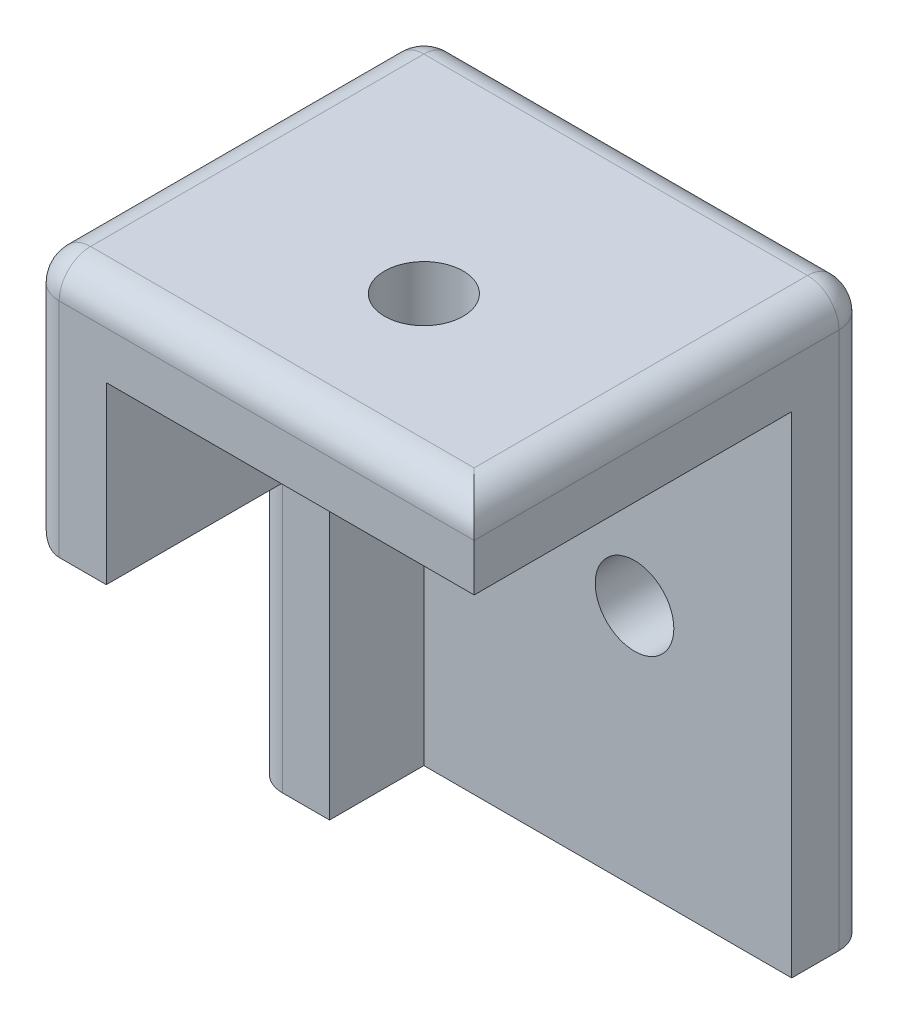
ISO-10303-21;
HEADER;
FILE_DESCRIPTION(('STEP AP214'),'2;1');
FILE_NAME('part.step','',(''),(''),'','','');
FILE_SCHEMA(('AUTOMOTIVE_DESIGN { 1 0 10303 214 1 1 1 1 }'));
ENDSEC;
DATA;
#1=APPLICATION_CONTEXT('core data for automotive mechanical design processes');
#2=APPLICATION_PROTOCOL_DEFINITION('international standard','automotive_design',2000,#1);
#3=PRODUCT_CONTEXT('',#1,'mechanical');
#4=PRODUCT('Part','Part','',(#3));
#5=PRODUCT_RELATED_PRODUCT_CATEGORY('part','',(#4));
#6=PRODUCT_DEFINITION_FORMATION('','',#4);
#7=PRODUCT_DEFINITION_CONTEXT('part definition',#1,'design');
#8=PRODUCT_DEFINITION('design','',#6,#7);
#9=PRODUCT_DEFINITION_SHAPE('','',#8);
#10=(LENGTH_UNIT() NAMED_UNIT(*) SI_UNIT(.MILLI.,.METRE.));
#11=(NAMED_UNIT(*) PLANE_ANGLE_UNIT() SI_UNIT($,.RADIAN.));
#12=(NAMED_UNIT(*) SI_UNIT($,.STERADIAN.) SOLID_ANGLE_UNIT());
#13=UNCERTAINTY_MEASURE_WITH_UNIT(LENGTH_MEASURE(1.E-05),#10,'distance_accuracy_value','');
#14=(GEOMETRIC_REPRESENTATION_CONTEXT(3) GLOBAL_UNCERTAINTY_ASSIGNED_CONTEXT((#13)) GLOBAL_UNIT_ASSIGNED_CONTEXT((#10,
#11,#12)) REPRESENTATION_CONTEXT('',''));
#15=CARTESIAN_POINT('',(0.,0.,0.));
#16=DIRECTION('',(0.,0.,1.));
#17=DIRECTION('',(1.,0.,0.));
#18=AXIS2_PLACEMENT_3D('',#15,#16,#17);
#19=CARTESIAN_POINT('',(0.,0.,5.));
#20=DIRECTION('',(0.,0.,1.));
#21=DIRECTION('',(1.,0.,0.));
#22=AXIS2_PLACEMENT_3D('',#19,#20,#21);
#23=PLANE('',#22);
#24=DIRECTION('',(0.,-1.,0.));
#25=VECTOR('',#24,1.);
#26=CARTESIAN_POINT('',(15.845883060774,-68.5684307221056,5.));
#27=LINE('',#26,#25);
#28=CARTESIAN_POINT('',(15.845883060774,-68.5684307221056,5.));
#29=VERTEX_POINT('',#28);
#30=CARTESIAN_POINT('',(15.845883060774,-99.7684307221056,5.));
#31=VERTEX_POINT('',#30);
#32=EDGE_CURVE('E244',#29,#31,#27,.T.);
#33=ORIENTED_EDGE('',*,*,#32,.T.);
#34=DIRECTION('',(1.,0.,0.));
#35=VECTOR('',#34,1.);
#36=CARTESIAN_POINT('',(15.845883060774,-99.7684307221056,5.));
#37=LINE('',#36,#35);
#38=CARTESIAN_POINT('',(39.2458830608002,-99.7684307221056,5.));
#39=VERTEX_POINT('',#38);
#40=EDGE_CURVE('E248',#31,#39,#37,.T.);
#41=ORIENTED_EDGE('',*,*,#40,.T.);
#42=DIRECTION('',(0.,1.,0.));
#43=VECTOR('',#42,1.);
#44=CARTESIAN_POINT('',(39.2458830608002,-68.5684307221056,5.));
#45=LINE('',#44,#43);
#46=CARTESIAN_POINT('',(39.2458830608002,-68.5684307221056,5.));
#47=VERTEX_POINT('',#46);
#48=EDGE_CURVE('E251',#39,#47,#45,.T.);
#49=ORIENTED_EDGE('',*,*,#48,.T.);
#50=DIRECTION('',(-1.,0.,0.));
#51=VECTOR('',#50,1.);
#52=CARTESIAN_POINT('',(15.845883060774,-68.5684307221056,5.));
#53=LINE('',#52,#51);
#54=EDGE_CURVE('E255',#47,#29,#53,.T.);
#55=ORIENTED_EDGE('',*,*,#54,.T.);
#56=EDGE_LOOP('',(#33,#41,#49,#55));
#57=FACE_BOUND('',#56,.T.);
#58=CARTESIAN_POINT('',(29.2458830608002,-84.2684307221055,5.));
#59=DIRECTION('',(0.,0.,1.));
#60=DIRECTION('',(1.,0.,0.));
#61=AXIS2_PLACEMENT_3D('',#58,#59,#60);
#62=CIRCLE('',#61,2.49999999997491);
#63=CARTESIAN_POINT('',(31.7458830607751,-84.2684307221055,5.));
#64=VERTEX_POINT('',#63);
#65=EDGE_CURVE('E236',#64,#64,#62,.T.);
#66=ORIENTED_EDGE('',*,*,#65,.F.);
#67=EDGE_LOOP('',(#66));
#68=FACE_BOUND('',#67,.T.);
#69=ADVANCED_FACE('F38',(#57,#68),#23,.T.);
#70=CARTESIAN_POINT('',(0.,0.,0.));
#71=DIRECTION('',(0.,0.,1.));
#72=DIRECTION('',(1.,0.,0.));
#73=AXIS2_PLACEMENT_3D('',#70,#71,#72);
#74=PLANE('',#73);
#75=DIRECTION('',(-1.,0.,0.));
#76=VECTOR('',#75,1.);
#77=CARTESIAN_POINT('',(39.2458830608002,-65.5684307221055,0.));
#78=LINE('',#77,#76);
#79=CARTESIAN_POINT('',(12.845883060774,-65.5684307221055,0.));
#80=VERTEX_POINT('',#79);
#81=CARTESIAN_POINT('',(37.2458830608002,-65.5684307221055,0.));
#82=VERTEX_POINT('',#81);
#83=EDGE_CURVE('E48',#80,#82,#78,.F.);
#84=ORIENTED_EDGE('',*,*,#83,.T.);
#85=DIRECTION('',(0.,1.,0.));
#86=VECTOR('',#85,1.);
#87=CARTESIAN_POINT('',(37.2458830608002,0.,0.));
#88=LINE('',#87,#86);
#89=CARTESIAN_POINT('',(37.2458830608002,-99.7684307221056,0.));
#90=VERTEX_POINT('',#89);
#91=EDGE_CURVE('E11',#82,#90,#88,.F.);
#92=ORIENTED_EDGE('',*,*,#91,.T.);
#93=DIRECTION('',(1.,0.,0.));
#94=VECTOR('',#93,1.);
#95=CARTESIAN_POINT('',(15.845883060774,-99.7684307221056,0.));
#96=LINE('',#95,#94);
#97=CARTESIAN_POINT('',(12.845883060774,-99.7684307221056,0.));
#98=VERTEX_POINT('',#97);
#99=EDGE_CURVE('E240',#98,#90,#96,.T.);
#100=ORIENTED_EDGE('',*,*,#99,.F.);
#101=DIRECTION('',(0.,1.,0.));
#102=VECTOR('',#101,1.);
#103=CARTESIAN_POINT('',(12.845883060774,0.,0.));
#104=LINE('',#103,#102);
#105=EDGE_CURVE('E65',#98,#80,#104,.T.);
#106=ORIENTED_EDGE('',*,*,#105,.T.);
#107=EDGE_LOOP('',(#84,#92,#100,#106));
#108=FACE_BOUND('',#107,.T.);
#109=CARTESIAN_POINT('',(29.2458830608002,-84.2684307221055,0.));
#110=DIRECTION('',(0.,0.,1.));
#111=DIRECTION('',(1.,0.,0.));
#112=AXIS2_PLACEMENT_3D('',#109,#110,#111);
#113=CIRCLE('',#112,2.49999999997491);
#114=CARTESIAN_POINT('',(31.7458830607751,-84.2684307221055,0.));
#115=VERTEX_POINT('',#114);
#116=EDGE_CURVE('E235',#115,#115,#113,.T.);
#117=ORIENTED_EDGE('',*,*,#116,.T.);
#118=EDGE_LOOP('',(#117));
#119=FACE_BOUND('',#118,.T.);
#120=ADVANCED_FACE('F416',(#108,#119),#74,.F.);
#121=CARTESIAN_POINT('',(15.845883060774,-99.7684307221056,5.));
#122=DIRECTION('',(0.,1.,0.));
#123=DIRECTION('',(0.,0.,1.));
#124=AXIS2_PLACEMENT_3D('',#121,#122,#123);
#125=PLANE('',#124);
#126=DIRECTION('',(1.,0.,0.));
#127=VECTOR('',#126,1.);
#128=CARTESIAN_POINT('',(10.845883060774,-99.7684307221056,11.));
#129=LINE('',#128,#127);
#130=CARTESIAN_POINT('',(12.845883060774,-99.7684307221056,11.));
#131=VERTEX_POINT('',#130);
#132=CARTESIAN_POINT('',(15.845883060774,-99.7684307221056,11.));
#133=VERTEX_POINT('',#132);
#134=EDGE_CURVE('E211',#131,#133,#129,.T.);
#135=ORIENTED_EDGE('',*,*,#134,.F.);
#136=CARTESIAN_POINT('',(12.845883060774,-99.7684307221056,8.99999999999999));
#137=DIRECTION('',(0.,1.,0.));
#138=DIRECTION('',(0.,0.,1.));
#139=AXIS2_PLACEMENT_3D('',#136,#137,#138);
#140=CIRCLE('',#139,2.);
#141=CARTESIAN_POINT('',(10.845883060774,-99.7684307221056,8.99999999999999));
#142=VERTEX_POINT('',#141);
#143=EDGE_CURVE('E298',#131,#142,#140,.F.);
#144=ORIENTED_EDGE('',*,*,#143,.T.);
#145=DIRECTION('',(0.,0.,-1.));
#146=VECTOR('',#145,1.);
#147=CARTESIAN_POINT('',(10.845883060774,-99.7684307221056,11.));
#148=LINE('',#147,#146);
#149=CARTESIAN_POINT('',(10.845883060774,-99.7684307221056,2.));
#150=VERTEX_POINT('',#149);
#151=EDGE_CURVE('E187',#142,#150,#148,.T.);
#152=ORIENTED_EDGE('',*,*,#151,.T.);
#153=CARTESIAN_POINT('',(12.845883060774,-99.7684307221056,2.));
#154=DIRECTION('',(0.,1.,0.));
#155=DIRECTION('',(0.,0.,1.));
#156=AXIS2_PLACEMENT_3D('',#153,#154,#155);
#157=CIRCLE('',#156,2.);
#158=EDGE_CURVE('E292',#150,#98,#157,.F.);
#159=ORIENTED_EDGE('',*,*,#158,.T.);
#160=ORIENTED_EDGE('',*,*,#99,.T.);
#161=CARTESIAN_POINT('',(37.2458830608002,-99.7684307221056,2.));
#162=DIRECTION('',(0.,1.,0.));
#163=DIRECTION('',(0.,0.,1.));
#164=AXIS2_PLACEMENT_3D('',#161,#162,#163);
#165=CIRCLE('',#164,2.);
#166=CARTESIAN_POINT('',(39.2458830608002,-99.7684307221056,2.));
#167=VERTEX_POINT('',#166);
#168=EDGE_CURVE('E295',#90,#167,#165,.F.);
#169=ORIENTED_EDGE('',*,*,#168,.T.);
#170=DIRECTION('',(0.,0.,-1.));
#171=VECTOR('',#170,1.);
#172=CARTESIAN_POINT('',(39.2458830608002,-99.7684307221056,5.));
#173=LINE('',#172,#171);
#174=EDGE_CURVE('E259',#39,#167,#173,.T.);
#175=ORIENTED_EDGE('',*,*,#174,.F.);
#176=ORIENTED_EDGE('',*,*,#40,.F.);
#177=DIRECTION('',(0.,0.,-1.));
#178=VECTOR('',#177,1.);
#179=CARTESIAN_POINT('',(15.845883060774,-99.7684307221056,11.));
#180=LINE('',#179,#178);
#181=EDGE_CURVE('E199',#133,#31,#180,.T.);
#182=ORIENTED_EDGE('',*,*,#181,.F.);
#183=EDGE_LOOP('',(#135,#144,#152,#159,#160,#169,#175,#176,#182));
#184=FACE_BOUND('',#183,.T.);
#185=ADVANCED_FACE('F380',(#184),#125,.F.);
#186=CARTESIAN_POINT('',(39.2458830608002,-68.5684307221056,5.));
#187=DIRECTION('',(-1.,0.,0.));
#188=DIRECTION('',(0.,0.,1.));
#189=AXIS2_PLACEMENT_3D('',#186,#187,#188);
#190=PLANE('',#189);
#191=DIRECTION('',(0.,1.,0.));
#192=VECTOR('',#191,1.);
#193=CARTESIAN_POINT('',(39.2458830608002,-68.5684307221056,2.));
#194=LINE('',#193,#192);
#195=CARTESIAN_POINT('',(39.2458830608002,-65.5684307221055,2.));
#196=VERTEX_POINT('',#195);
#197=EDGE_CURVE('E314',#167,#196,#194,.T.);
#198=ORIENTED_EDGE('',*,*,#197,.T.);
#199=DIRECTION('',(0.,0.,-1.));
#200=VECTOR('',#199,1.);
#201=CARTESIAN_POINT('',(39.2458830608002,-65.5684307221055,25.2));
#202=LINE('',#201,#200);
#203=CARTESIAN_POINT('',(39.2458830608002,-65.5684307221055,25.2));
#204=VERTEX_POINT('',#203);
#205=EDGE_CURVE('E317',#196,#204,#202,.F.);
#206=ORIENTED_EDGE('',*,*,#205,.T.);
#207=DIRECTION('',(0.,-1.,0.));
#208=VECTOR('',#207,1.);
#209=CARTESIAN_POINT('',(39.2458830608002,-63.5684307221056,25.2));
#210=LINE('',#209,#208);
#211=CARTESIAN_POINT('',(39.2458830608002,-68.5684307221056,25.2));
#212=VERTEX_POINT('',#211);
#213=EDGE_CURVE('E232',#204,#212,#210,.T.);
#214=ORIENTED_EDGE('',*,*,#213,.T.);
#215=DIRECTION('',(0.,0.,-1.));
#216=VECTOR('',#215,1.);
#217=CARTESIAN_POINT('',(39.2458830608002,-68.5684307221056,0.));
#218=LINE('',#217,#216);
#219=EDGE_CURVE('E228',#212,#47,#218,.T.);
#220=ORIENTED_EDGE('',*,*,#219,.T.);
#221=ORIENTED_EDGE('',*,*,#48,.F.);
#222=ORIENTED_EDGE('',*,*,#174,.T.);
#223=EDGE_LOOP('',(#198,#206,#214,#220,#221,#222));
#224=FACE_BOUND('',#223,.T.);
#225=ADVANCED_FACE('F428',(#224),#190,.F.);
#226=CARTESIAN_POINT('',(29.2458830608002,-84.2684307221055,5.));
#227=DIRECTION('',(0.,0.,-1.));
#228=DIRECTION('',(-1.,0.,0.));
#229=AXIS2_PLACEMENT_3D('',#226,#227,#228);
#230=CYLINDRICAL_SURFACE('',#229,2.49999999997491);
#231=ORIENTED_EDGE('',*,*,#65,.T.);
#232=EDGE_LOOP('',(#231));
#233=FACE_BOUND('',#232,.T.);
#234=ORIENTED_EDGE('',*,*,#116,.F.);
#235=EDGE_LOOP('',(#234));
#236=FACE_BOUND('',#235,.T.);
#237=ADVANCED_FACE('F425',(#233,#236),#230,.F.);
#238=CARTESIAN_POINT('',(0.,-63.5684307221056,0.));
#239=DIRECTION('',(0.,1.,0.));
#240=DIRECTION('',(0.,0.,1.));
#241=AXIS2_PLACEMENT_3D('',#238,#239,#240);
#242=PLANE('',#241);
#243=DIRECTION('',(0.,0.,1.));
#244=VECTOR('',#243,1.);
#245=CARTESIAN_POINT('',(12.845883060774,-63.5684307221056,25.2));
#246=LINE('',#245,#244);
#247=CARTESIAN_POINT('',(12.845883060774,-63.5684307221056,2.));
#248=VERTEX_POINT('',#247);
#249=CARTESIAN_POINT('',(12.845883060774,-63.5684307221056,23.2));
#250=VERTEX_POINT('',#249);
#251=EDGE_CURVE('E304',#248,#250,#246,.T.);
#252=ORIENTED_EDGE('',*,*,#251,.T.);
#253=DIRECTION('',(1.,0.,0.));
#254=VECTOR('',#253,1.);
#255=CARTESIAN_POINT('',(39.2458830608002,-63.5684307221056,23.2));
#256=LINE('',#255,#254);
#257=CARTESIAN_POINT('',(37.2458830608002,-63.5684307221056,23.2));
#258=VERTEX_POINT('',#257);
#259=EDGE_CURVE('E310',#250,#258,#256,.T.);
#260=ORIENTED_EDGE('',*,*,#259,.T.);
#261=DIRECTION('',(0.,0.,-1.));
#262=VECTOR('',#261,1.);
#263=CARTESIAN_POINT('',(37.2458830608002,-63.5684307221056,0.));
#264=LINE('',#263,#262);
#265=CARTESIAN_POINT('',(37.2458830608002,-63.5684307221056,2.));
#266=VERTEX_POINT('',#265);
#267=EDGE_CURVE('E307',#258,#266,#264,.T.);
#268=ORIENTED_EDGE('',*,*,#267,.T.);
#269=DIRECTION('',(-1.,0.,0.));
#270=VECTOR('',#269,1.);
#271=CARTESIAN_POINT('',(10.845883060774,-63.5684307221056,2.));
#272=LINE('',#271,#270);
#273=EDGE_CURVE('E301',#266,#248,#272,.T.);
#274=ORIENTED_EDGE('',*,*,#273,.T.);
#275=EDGE_LOOP('',(#252,#260,#268,#274));
#276=FACE_BOUND('',#275,.T.);
#277=CARTESIAN_POINT('',(26.045883060774,-63.5684307221056,15.2));
#278=DIRECTION('',(0.,1.,0.));
#279=DIRECTION('',(0.,0.,1.));
#280=AXIS2_PLACEMENT_3D('',#277,#278,#279);
#281=CIRCLE('',#280,2.5);
#282=CARTESIAN_POINT('',(26.045883060774,-63.5684307221056,17.7));
#283=VERTEX_POINT('',#282);
#284=EDGE_CURVE('E216',#283,#283,#281,.T.);
#285=ORIENTED_EDGE('',*,*,#284,.F.);
#286=EDGE_LOOP('',(#285));
#287=FACE_BOUND('',#286,.T.);
#288=ADVANCED_FACE('F397',(#276,#287),#242,.T.);
#289=CARTESIAN_POINT('',(0.,-68.5684307221056,0.));
#290=DIRECTION('',(0.,1.,0.));
#291=DIRECTION('',(0.,0.,1.));
#292=AXIS2_PLACEMENT_3D('',#289,#290,#291);
#293=PLANE('',#292);
#294=ORIENTED_EDGE('',*,*,#54,.F.);
#295=ORIENTED_EDGE('',*,*,#219,.F.);
#296=DIRECTION('',(1.,0.,0.));
#297=VECTOR('',#296,1.);
#298=CARTESIAN_POINT('',(15.845883060774,-68.5684307221056,25.2));
#299=LINE('',#298,#297);
#300=CARTESIAN_POINT('',(15.845883060774,-68.5684307221056,25.2));
#301=VERTEX_POINT('',#300);
#302=EDGE_CURVE('E225',#301,#212,#299,.T.);
#303=ORIENTED_EDGE('',*,*,#302,.F.);
#304=DIRECTION('',(0.,0.,1.));
#305=VECTOR('',#304,1.);
#306=CARTESIAN_POINT('',(15.845883060774,-68.5684307221056,0.));
#307=LINE('',#306,#305);
#308=EDGE_CURVE('E197',#29,#301,#307,.T.);
#309=ORIENTED_EDGE('',*,*,#308,.F.);
#310=EDGE_LOOP('',(#294,#295,#303,#309));
#311=FACE_BOUND('',#310,.T.);
#312=CARTESIAN_POINT('',(26.045883060774,-68.5684307221056,15.2));
#313=DIRECTION('',(0.,1.,0.));
#314=DIRECTION('',(0.,0.,1.));
#315=AXIS2_PLACEMENT_3D('',#312,#313,#314);
#316=CIRCLE('',#315,2.5);
#317=CARTESIAN_POINT('',(26.045883060774,-68.5684307221056,17.7));
#318=VERTEX_POINT('',#317);
#319=EDGE_CURVE('E214',#318,#318,#316,.T.);
#320=ORIENTED_EDGE('',*,*,#319,.T.);
#321=EDGE_LOOP('',(#320));
#322=FACE_BOUND('',#321,.T.);
#323=ADVANCED_FACE('F499',(#311,#322),#293,.F.);
#324=CARTESIAN_POINT('',(15.845883060774,-63.5684307221056,25.2));
#325=DIRECTION('',(0.,0.,-1.));
#326=DIRECTION('',(-1.,0.,0.));
#327=AXIS2_PLACEMENT_3D('',#324,#325,#326);
#328=PLANE('',#327);
#329=DIRECTION('',(1.,0.,0.));
#330=VECTOR('',#329,1.);
#331=CARTESIAN_POINT('',(10.845883060774,-65.5684307221055,25.2));
#332=LINE('',#331,#330);
#333=CARTESIAN_POINT('',(12.845883060774,-65.5684307221055,25.2));
#334=VERTEX_POINT('',#333);
#335=EDGE_CURVE('E266',#204,#334,#332,.F.);
#336=ORIENTED_EDGE('',*,*,#335,.T.);
#337=DIRECTION('',(0.,-1.,0.));
#338=VECTOR('',#337,1.);
#339=CARTESIAN_POINT('',(12.845883060774,-63.5684307221056,25.2));
#340=LINE('',#339,#338);
#341=CARTESIAN_POINT('',(12.845883060774,-79.7026697361671,25.2));
#342=VERTEX_POINT('',#341);
#343=EDGE_CURVE('E182',#334,#342,#340,.T.);
#344=ORIENTED_EDGE('',*,*,#343,.T.);
#345=DIRECTION('',(1.,0.,0.));
#346=VECTOR('',#345,1.);
#347=CARTESIAN_POINT('',(10.845883060774,-79.7026697361671,25.2));
#348=LINE('',#347,#346);
#349=CARTESIAN_POINT('',(15.845883060774,-79.7026697361671,25.2));
#350=VERTEX_POINT('',#349);
#351=EDGE_CURVE('E176',#342,#350,#348,.T.);
#352=ORIENTED_EDGE('',*,*,#351,.T.);
#353=DIRECTION('',(0.,-1.,0.));
#354=VECTOR('',#353,1.);
#355=CARTESIAN_POINT('',(15.845883060774,-63.5684307221056,25.2));
#356=LINE('',#355,#354);
#357=EDGE_CURVE('E180',#301,#350,#356,.T.);
#358=ORIENTED_EDGE('',*,*,#357,.F.);
#359=ORIENTED_EDGE('',*,*,#302,.T.);
#360=ORIENTED_EDGE('',*,*,#213,.F.);
#361=EDGE_LOOP('',(#336,#344,#352,#358,#359,#360));
#362=FACE_BOUND('',#361,.T.);
#363=ADVANCED_FACE('F178',(#362),#328,.F.);
#364=CARTESIAN_POINT('',(26.045883060774,-63.5684307221056,15.2));
#365=DIRECTION('',(0.,-1.,0.));
#366=DIRECTION('',(0.,0.,-1.));
#367=AXIS2_PLACEMENT_3D('',#364,#365,#366);
#368=CYLINDRICAL_SURFACE('',#367,2.5);
#369=ORIENTED_EDGE('',*,*,#284,.T.);
#370=EDGE_LOOP('',(#369));
#371=FACE_BOUND('',#370,.T.);
#372=ORIENTED_EDGE('',*,*,#319,.F.);
#373=EDGE_LOOP('',(#372));
#374=FACE_BOUND('',#373,.T.);
#375=ADVANCED_FACE('F498',(#371,#374),#368,.F.);
#376=CARTESIAN_POINT('',(15.845883060774,0.,0.));
#377=DIRECTION('',(1.,0.,0.));
#378=DIRECTION('',(0.,1.,0.));
#379=AXIS2_PLACEMENT_3D('',#376,#377,#378);
#380=PLANE('',#379);
#381=ORIENTED_EDGE('',*,*,#32,.F.);
#382=ORIENTED_EDGE('',*,*,#308,.T.);
#383=ORIENTED_EDGE('',*,*,#357,.T.);
#384=DIRECTION('',(0.,0.,-1.));
#385=VECTOR('',#384,1.);
#386=CARTESIAN_POINT('',(15.845883060774,-79.7026697361671,25.2));
#387=LINE('',#386,#385);
#388=CARTESIAN_POINT('',(15.845883060774,-79.7026697361671,11.));
#389=VERTEX_POINT('',#388);
#390=EDGE_CURVE('E195',#350,#389,#387,.T.);
#391=ORIENTED_EDGE('',*,*,#390,.T.);
#392=DIRECTION('',(0.,-1.,0.));
#393=VECTOR('',#392,1.);
#394=CARTESIAN_POINT('',(15.845883060774,-79.7026697361671,11.));
#395=LINE('',#394,#393);
#396=EDGE_CURVE('E204',#389,#133,#395,.T.);
#397=ORIENTED_EDGE('',*,*,#396,.T.);
#398=ORIENTED_EDGE('',*,*,#181,.T.);
#399=EDGE_LOOP('',(#381,#382,#383,#391,#397,#398));
#400=FACE_BOUND('',#399,.T.);
#401=ADVANCED_FACE('F193',(#400),#380,.T.);
#402=CARTESIAN_POINT('',(10.845883060774,-79.7026697361671,11.));
#403=DIRECTION('',(0.,0.,1.));
#404=DIRECTION('',(0.,-1.,0.));
#405=AXIS2_PLACEMENT_3D('',#402,#403,#404);
#406=PLANE('',#405);
#407=DIRECTION('',(1.,0.,0.));
#408=VECTOR('',#407,1.);
#409=CARTESIAN_POINT('',(10.845883060774,-79.7026697361671,11.));
#410=LINE('',#409,#408);
#411=CARTESIAN_POINT('',(12.845883060774,-79.7026697361671,11.));
#412=VERTEX_POINT('',#411);
#413=EDGE_CURVE('E186',#412,#389,#410,.T.);
#414=ORIENTED_EDGE('',*,*,#413,.F.);
#415=DIRECTION('',(0.,-1.,0.));
#416=VECTOR('',#415,1.);
#417=CARTESIAN_POINT('',(12.845883060774,-99.7684307221056,11.));
#418=LINE('',#417,#416);
#419=EDGE_CURVE('E289',#412,#131,#418,.T.);
#420=ORIENTED_EDGE('',*,*,#419,.T.);
#421=ORIENTED_EDGE('',*,*,#134,.T.);
#422=ORIENTED_EDGE('',*,*,#396,.F.);
#423=EDGE_LOOP('',(#414,#420,#421,#422));
#424=FACE_BOUND('',#423,.T.);
#425=ADVANCED_FACE('F539',(#424),#406,.T.);
#426=CARTESIAN_POINT('',(10.845883060774,-79.7026697361671,25.2));
#427=DIRECTION('',(0.,-1.,0.));
#428=DIRECTION('',(1.,0.,0.));
#429=AXIS2_PLACEMENT_3D('',#426,#427,#428);
#430=PLANE('',#429);
#431=ORIENTED_EDGE('',*,*,#351,.F.);
#432=DIRECTION('',(0.,0.,-1.));
#433=VECTOR('',#432,1.);
#434=CARTESIAN_POINT('',(12.845883060774,-79.7026697361671,11.));
#435=LINE('',#434,#433);
#436=EDGE_CURVE('E286',#342,#412,#435,.T.);
#437=ORIENTED_EDGE('',*,*,#436,.T.);
#438=ORIENTED_EDGE('',*,*,#413,.T.);
#439=ORIENTED_EDGE('',*,*,#390,.F.);
#440=EDGE_LOOP('',(#431,#437,#438,#439));
#441=FACE_BOUND('',#440,.T.);
#442=ADVANCED_FACE('F201',(#441),#430,.T.);
#443=CARTESIAN_POINT('',(10.845883060774,0.,0.));
#444=DIRECTION('',(1.,0.,0.));
#445=DIRECTION('',(0.,1.,0.));
#446=AXIS2_PLACEMENT_3D('',#443,#444,#445);
#447=PLANE('',#446);
#448=ORIENTED_EDGE('',*,*,#151,.F.);
#449=DIRECTION('',(0.,-1.,0.));
#450=VECTOR('',#449,1.);
#451=CARTESIAN_POINT('',(10.845883060774,-79.7026697361671,8.99999999999999));
#452=LINE('',#451,#450);
#453=CARTESIAN_POINT('',(10.845883060774,-77.7026697361671,8.99999999999999));
#454=VERTEX_POINT('',#453);
#455=EDGE_CURVE('E283',#142,#454,#452,.F.);
#456=ORIENTED_EDGE('',*,*,#455,.T.);
#457=DIRECTION('',(0.,0.,-1.));
#458=VECTOR('',#457,1.);
#459=CARTESIAN_POINT('',(10.845883060774,-77.7026697361671,25.2));
#460=LINE('',#459,#458);
#461=CARTESIAN_POINT('',(10.845883060774,-77.7026697361671,23.2));
#462=VERTEX_POINT('',#461);
#463=EDGE_CURVE('E280',#454,#462,#460,.F.);
#464=ORIENTED_EDGE('',*,*,#463,.T.);
#465=DIRECTION('',(0.,-1.,0.));
#466=VECTOR('',#465,1.);
#467=CARTESIAN_POINT('',(10.845883060774,0.,23.2));
#468=LINE('',#467,#466);
#469=CARTESIAN_POINT('',(10.845883060774,-65.5684307221055,23.2));
#470=VERTEX_POINT('',#469);
#471=EDGE_CURVE('E277',#462,#470,#468,.F.);
#472=ORIENTED_EDGE('',*,*,#471,.T.);
#473=DIRECTION('',(0.,0.,1.));
#474=VECTOR('',#473,1.);
#475=CARTESIAN_POINT('',(10.845883060774,-65.5684307221055,0.));
#476=LINE('',#475,#474);
#477=CARTESIAN_POINT('',(10.845883060774,-65.5684307221055,2.));
#478=VERTEX_POINT('',#477);
#479=EDGE_CURVE('E274',#470,#478,#476,.F.);
#480=ORIENTED_EDGE('',*,*,#479,.T.);
#481=DIRECTION('',(0.,1.,0.));
#482=VECTOR('',#481,1.);
#483=CARTESIAN_POINT('',(10.845883060774,0.,2.));
#484=LINE('',#483,#482);
#485=EDGE_CURVE('E271',#478,#150,#484,.F.);
#486=ORIENTED_EDGE('',*,*,#485,.T.);
#487=EDGE_LOOP('',(#448,#456,#464,#472,#480,#486));
#488=FACE_BOUND('',#487,.T.);
#489=ADVANCED_FACE('F555',(#488),#447,.F.);
#490=CARTESIAN_POINT('',(37.2458830608002,-68.5684307221056,2.));
#491=DIRECTION('',(0.,1.,0.));
#492=DIRECTION('',(0.,0.,1.));
#493=AXIS2_PLACEMENT_3D('',#490,#491,#492);
#494=CYLINDRICAL_SURFACE('',#493,2.);
#495=ORIENTED_EDGE('',*,*,#168,.F.);
#496=ORIENTED_EDGE('',*,*,#91,.F.);
#497=CARTESIAN_POINT('',(37.2458830608002,-65.5684307221055,2.));
#498=DIRECTION('',(0.,1.,0.));
#499=DIRECTION('',(0.,0.,1.));
#500=AXIS2_PLACEMENT_3D('',#497,#498,#499);
#501=CIRCLE('',#500,2.);
#502=EDGE_CURVE('E361',#196,#82,#501,.T.);
#503=ORIENTED_EDGE('',*,*,#502,.F.);
#504=ORIENTED_EDGE('',*,*,#197,.F.);
#505=EDGE_LOOP('',(#495,#496,#503,#504));
#506=FACE_BOUND('',#505,.T.);
#507=ADVANCED_FACE('F40',(#506),#494,.T.);
#508=CARTESIAN_POINT('',(12.845883060774,0.,2.));
#509=DIRECTION('',(0.,1.,0.));
#510=DIRECTION('',(-1.,0.,0.));
#511=AXIS2_PLACEMENT_3D('',#508,#509,#510);
#512=CYLINDRICAL_SURFACE('',#511,2.);
#513=ORIENTED_EDGE('',*,*,#158,.F.);
#514=ORIENTED_EDGE('',*,*,#485,.F.);
#515=CARTESIAN_POINT('',(12.845883060774,-65.5684307221055,2.));
#516=DIRECTION('',(0.,1.,0.));
#517=DIRECTION('',(0.,0.,1.));
#518=AXIS2_PLACEMENT_3D('',#515,#516,#517);
#519=CIRCLE('',#518,2.);
#520=EDGE_CURVE('E358',#80,#478,#519,.T.);
#521=ORIENTED_EDGE('',*,*,#520,.F.);
#522=ORIENTED_EDGE('',*,*,#105,.F.);
#523=EDGE_LOOP('',(#513,#514,#521,#522));
#524=FACE_BOUND('',#523,.T.);
#525=ADVANCED_FACE('F386',(#524),#512,.T.);
#526=CARTESIAN_POINT('',(0.,-65.5684307221055,2.));
#527=DIRECTION('',(1.,0.,0.));
#528=DIRECTION('',(0.,0.,-1.));
#529=AXIS2_PLACEMENT_3D('',#526,#527,#528);
#530=CYLINDRICAL_SURFACE('',#529,2.);
#531=CARTESIAN_POINT('',(37.2458830608002,-65.5684307221055,2.));
#532=DIRECTION('',(1.,0.,0.));
#533=DIRECTION('',(0.,0.,-1.));
#534=AXIS2_PLACEMENT_3D('',#531,#532,#533);
#535=CIRCLE('',#534,2.);
#536=EDGE_CURVE('E42',#82,#266,#535,.T.);
#537=ORIENTED_EDGE('',*,*,#536,.F.);
#538=ORIENTED_EDGE('',*,*,#83,.F.);
#539=CARTESIAN_POINT('',(12.845883060774,-65.5684307221055,2.));
#540=DIRECTION('',(-1.,0.,0.));
#541=DIRECTION('',(0.,0.,1.));
#542=AXIS2_PLACEMENT_3D('',#539,#540,#541);
#543=CIRCLE('',#542,2.);
#544=EDGE_CURVE('E354',#248,#80,#543,.T.);
#545=ORIENTED_EDGE('',*,*,#544,.F.);
#546=ORIENTED_EDGE('',*,*,#273,.F.);
#547=EDGE_LOOP('',(#537,#538,#545,#546));
#548=FACE_BOUND('',#547,.T.);
#549=ADVANCED_FACE('F395',(#548),#530,.T.);
#550=CARTESIAN_POINT('',(37.2458830608002,-65.5684307221055,2.));
#551=DIRECTION('',(0.,0.,1.));
#552=DIRECTION('',(1.,0.,0.));
#553=AXIS2_PLACEMENT_3D('',#550,#551,#552);
#554=SPHERICAL_SURFACE('',#553,2.);
#555=ORIENTED_EDGE('',*,*,#502,.T.);
#556=ORIENTED_EDGE('',*,*,#536,.T.);
#557=CARTESIAN_POINT('',(37.2458830608002,-65.5684307221055,2.));
#558=DIRECTION('',(0.,0.,-1.));
#559=DIRECTION('',(-1.,0.,0.));
#560=AXIS2_PLACEMENT_3D('',#557,#558,#559);
#561=CIRCLE('',#560,2.);
#562=EDGE_CURVE('E350',#196,#266,#561,.F.);
#563=ORIENTED_EDGE('',*,*,#562,.F.);
#564=EDGE_LOOP('',(#555,#556,#563));
#565=FACE_BOUND('',#564,.T.);
#566=ADVANCED_FACE('F406',(#565),#554,.T.);
#567=CARTESIAN_POINT('',(12.845883060774,-65.5684307221055,2.));
#568=DIRECTION('',(0.,0.,1.));
#569=DIRECTION('',(1.,0.,0.));
#570=AXIS2_PLACEMENT_3D('',#567,#568,#569);
#571=SPHERICAL_SURFACE('',#570,2.);
#572=ORIENTED_EDGE('',*,*,#544,.T.);
#573=ORIENTED_EDGE('',*,*,#520,.T.);
#574=CARTESIAN_POINT('',(12.845883060774,-65.5684307221055,2.));
#575=DIRECTION('',(0.,0.,-1.));
#576=DIRECTION('',(-1.,0.,0.));
#577=AXIS2_PLACEMENT_3D('',#574,#575,#576);
#578=CIRCLE('',#577,2.);
#579=EDGE_CURVE('E346',#248,#478,#578,.F.);
#580=ORIENTED_EDGE('',*,*,#579,.F.);
#581=EDGE_LOOP('',(#572,#573,#580));
#582=FACE_BOUND('',#581,.T.);
#583=ADVANCED_FACE('F391',(#582),#571,.T.);
#584=CARTESIAN_POINT('',(37.2458830608002,-65.5684307221055,0.));
#585=DIRECTION('',(0.,0.,1.));
#586=DIRECTION('',(1.,0.,0.));
#587=AXIS2_PLACEMENT_3D('',#584,#585,#586);
#588=CYLINDRICAL_SURFACE('',#587,2.);
#589=ORIENTED_EDGE('',*,*,#562,.T.);
#590=ORIENTED_EDGE('',*,*,#267,.F.);
#591=CARTESIAN_POINT('',(37.2458830608002,-65.5684307221055,23.2));
#592=DIRECTION('',(-0.707106781186547,0.,0.707106781186547));
#593=DIRECTION('',(0.707106781186547,0.,0.707106781186547));
#594=AXIS2_PLACEMENT_3D('',#591,#592,#593);
#595=ELLIPSE('',#594,2.82842712474619,2.);
#596=EDGE_CURVE('E343',#204,#258,#595,.T.);
#597=ORIENTED_EDGE('',*,*,#596,.F.);
#598=ORIENTED_EDGE('',*,*,#205,.F.);
#599=EDGE_LOOP('',(#589,#590,#597,#598));
#600=FACE_BOUND('',#599,.T.);
#601=ADVANCED_FACE('F403',(#600),#588,.T.);
#602=CARTESIAN_POINT('',(12.845883060774,-65.5684307221055,0.));
#603=DIRECTION('',(0.,0.,-1.));
#604=DIRECTION('',(-1.,0.,0.));
#605=AXIS2_PLACEMENT_3D('',#602,#603,#604);
#606=CYLINDRICAL_SURFACE('',#605,2.);
#607=ORIENTED_EDGE('',*,*,#579,.T.);
#608=ORIENTED_EDGE('',*,*,#479,.F.);
#609=CARTESIAN_POINT('',(12.845883060774,-65.5684307221055,23.2));
#610=DIRECTION('',(0.,0.,1.));
#611=DIRECTION('',(1.,0.,0.));
#612=AXIS2_PLACEMENT_3D('',#609,#610,#611);
#613=CIRCLE('',#612,2.);
#614=EDGE_CURVE('E339',#250,#470,#613,.T.);
#615=ORIENTED_EDGE('',*,*,#614,.F.);
#616=ORIENTED_EDGE('',*,*,#251,.F.);
#617=EDGE_LOOP('',(#607,#608,#615,#616));
#618=FACE_BOUND('',#617,.T.);
#619=ADVANCED_FACE('F453',(#618),#606,.T.);
#620=CARTESIAN_POINT('',(0.,-65.5684307221055,23.2));
#621=DIRECTION('',(-1.,0.,0.));
#622=DIRECTION('',(0.,0.,1.));
#623=AXIS2_PLACEMENT_3D('',#620,#621,#622);
#624=CYLINDRICAL_SURFACE('',#623,2.);
#625=ORIENTED_EDGE('',*,*,#596,.T.);
#626=ORIENTED_EDGE('',*,*,#259,.F.);
#627=CARTESIAN_POINT('',(12.845883060774,-65.5684307221055,23.2));
#628=DIRECTION('',(-1.,0.,0.));
#629=DIRECTION('',(0.,-1.,0.));
#630=AXIS2_PLACEMENT_3D('',#627,#628,#629);
#631=CIRCLE('',#630,2.);
#632=EDGE_CURVE('E335',#334,#250,#631,.T.);
#633=ORIENTED_EDGE('',*,*,#632,.F.);
#634=ORIENTED_EDGE('',*,*,#335,.F.);
#635=EDGE_LOOP('',(#625,#626,#633,#634));
#636=FACE_BOUND('',#635,.T.);
#637=ADVANCED_FACE('F449',(#636),#624,.T.);
#638=CARTESIAN_POINT('',(12.845883060774,-79.7026697361671,8.99999999999999));
#639=DIRECTION('',(0.,1.,0.));
#640=DIRECTION('',(-1.,0.,0.));
#641=AXIS2_PLACEMENT_3D('',#638,#639,#640);
#642=CYLINDRICAL_SURFACE('',#641,2.);
#643=ORIENTED_EDGE('',*,*,#143,.F.);
#644=ORIENTED_EDGE('',*,*,#419,.F.);
#645=CARTESIAN_POINT('',(12.845883060774,-77.7026697361671,8.99999999999999));
#646=DIRECTION('',(0.,0.707106781186547,0.707106781186547));
#647=DIRECTION('',(0.,-0.707106781186548,0.707106781186547));
#648=AXIS2_PLACEMENT_3D('',#645,#646,#647);
#649=ELLIPSE('',#648,2.82842712474619,2.);
#650=EDGE_CURVE('E331',#454,#412,#649,.T.);
#651=ORIENTED_EDGE('',*,*,#650,.F.);
#652=ORIENTED_EDGE('',*,*,#455,.F.);
#653=EDGE_LOOP('',(#643,#644,#651,#652));
#654=FACE_BOUND('',#653,.T.);
#655=ADVANCED_FACE('F445',(#654),#642,.T.);
#656=CARTESIAN_POINT('',(12.845883060774,-65.5684307221055,23.2));
#657=DIRECTION('',(0.,0.,1.));
#658=DIRECTION('',(1.,0.,0.));
#659=AXIS2_PLACEMENT_3D('',#656,#657,#658);
#660=SPHERICAL_SURFACE('',#659,2.);
#661=ORIENTED_EDGE('',*,*,#632,.T.);
#662=ORIENTED_EDGE('',*,*,#614,.T.);
#663=CARTESIAN_POINT('',(12.845883060774,-65.5684307221055,23.2));
#664=DIRECTION('',(0.,1.,0.));
#665=DIRECTION('',(0.,0.,1.));
#666=AXIS2_PLACEMENT_3D('',#663,#664,#665);
#667=CIRCLE('',#666,2.);
#668=EDGE_CURVE('E327',#334,#470,#667,.F.);
#669=ORIENTED_EDGE('',*,*,#668,.F.);
#670=EDGE_LOOP('',(#661,#662,#669));
#671=FACE_BOUND('',#670,.T.);
#672=ADVANCED_FACE('F441',(#671),#660,.T.);
#673=CARTESIAN_POINT('',(12.845883060774,-77.7026697361671,25.2));
#674=DIRECTION('',(0.,0.,1.));
#675=DIRECTION('',(1.,0.,0.));
#676=AXIS2_PLACEMENT_3D('',#673,#674,#675);
#677=CYLINDRICAL_SURFACE('',#676,2.);
#678=ORIENTED_EDGE('',*,*,#650,.T.);
#679=ORIENTED_EDGE('',*,*,#436,.F.);
#680=CARTESIAN_POINT('',(12.845883060774,-77.7026697361671,23.2));
#681=DIRECTION('',(0.,0.707106781186547,0.707106781186547));
#682=DIRECTION('',(0.,-0.707106781186547,0.707106781186547));
#683=AXIS2_PLACEMENT_3D('',#680,#681,#682);
#684=ELLIPSE('',#683,2.82842712474619,2.);
#685=EDGE_CURVE('E324',#462,#342,#684,.T.);
#686=ORIENTED_EDGE('',*,*,#685,.F.);
#687=ORIENTED_EDGE('',*,*,#463,.F.);
#688=EDGE_LOOP('',(#678,#679,#686,#687));
#689=FACE_BOUND('',#688,.T.);
#690=ADVANCED_FACE('F437',(#689),#677,.T.);
#691=CARTESIAN_POINT('',(12.845883060774,-63.5684307221056,23.2));
#692=DIRECTION('',(0.,-1.,0.));
#693=DIRECTION('',(1.,0.,0.));
#694=AXIS2_PLACEMENT_3D('',#691,#692,#693);
#695=CYLINDRICAL_SURFACE('',#694,2.);
#696=ORIENTED_EDGE('',*,*,#668,.T.);
#697=ORIENTED_EDGE('',*,*,#471,.F.);
#698=ORIENTED_EDGE('',*,*,#685,.T.);
#699=ORIENTED_EDGE('',*,*,#343,.F.);
#700=EDGE_LOOP('',(#696,#697,#698,#699));
#701=FACE_BOUND('',#700,.T.);
#702=ADVANCED_FACE('F434',(#701),#695,.T.);
#703=CLOSED_SHELL('',(#69,#120,#185,#225,#237,#288,#323,#363,#375,#401,#425,#442,#489,#507,#525,
#549,#566,#583,#601,#619,#637,#655,#672,#690,#702));
#704=MANIFOLD_SOLID_BREP('B2',#703);
#705=ADVANCED_BREP_SHAPE_REPRESENTATION('',(#18,#704),#14);
#706=SHAPE_DEFINITION_REPRESENTATION(#9,#705);
ENDSEC;
END-ISO-10303-21;
